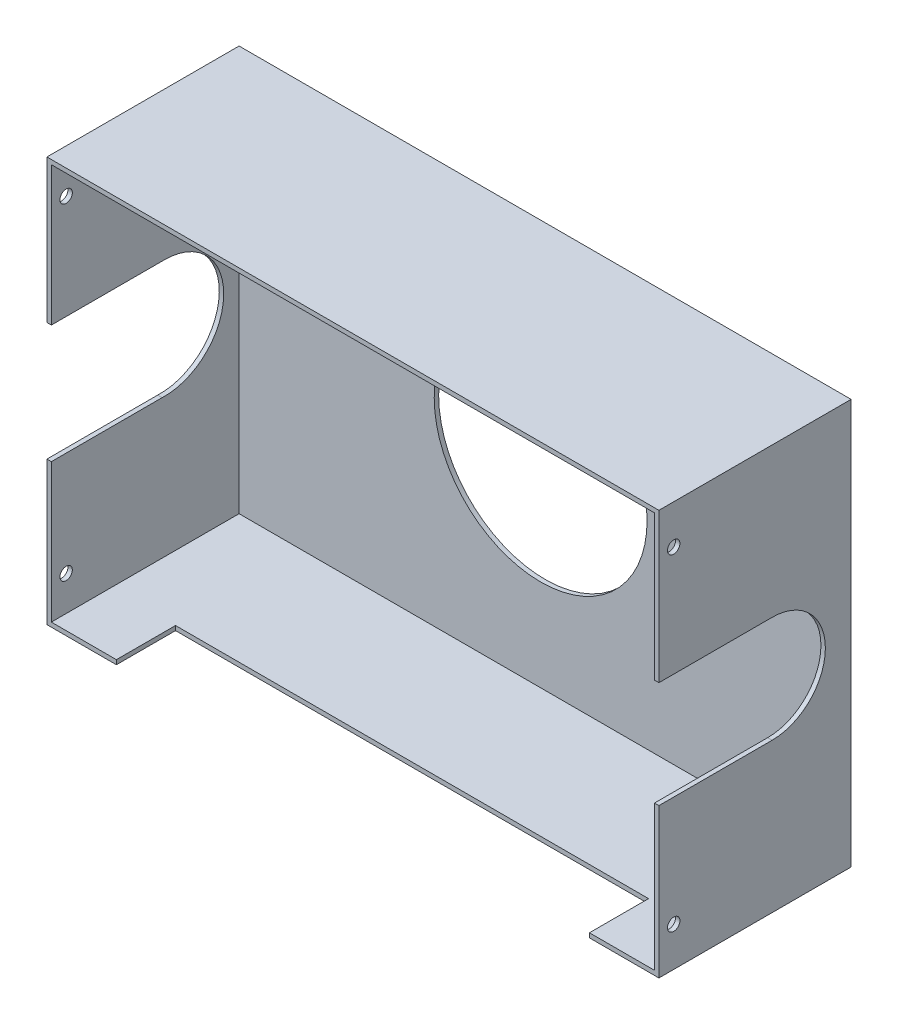
ISO-10303-21;
HEADER;
FILE_DESCRIPTION(('STEP AP214'),'2;1');
FILE_NAME('part.step','',(''),(''),'','','');
FILE_SCHEMA(('AUTOMOTIVE_DESIGN { 1 0 10303 214 1 1 1 1 }'));
ENDSEC;
DATA;
#1=APPLICATION_CONTEXT('core data for automotive mechanical design processes');
#2=APPLICATION_PROTOCOL_DEFINITION('international standard','automotive_design',2000,#1);
#3=PRODUCT_CONTEXT('',#1,'mechanical');
#4=PRODUCT('Part','Part','',(#3));
#5=PRODUCT_RELATED_PRODUCT_CATEGORY('part','',(#4));
#6=PRODUCT_DEFINITION_FORMATION('','',#4);
#7=PRODUCT_DEFINITION_CONTEXT('part definition',#1,'design');
#8=PRODUCT_DEFINITION('design','',#6,#7);
#9=PRODUCT_DEFINITION_SHAPE('','',#8);
#10=(LENGTH_UNIT() NAMED_UNIT(*) SI_UNIT(.MILLI.,.METRE.));
#11=(NAMED_UNIT(*) PLANE_ANGLE_UNIT() SI_UNIT($,.RADIAN.));
#12=(NAMED_UNIT(*) SI_UNIT($,.STERADIAN.) SOLID_ANGLE_UNIT());
#13=UNCERTAINTY_MEASURE_WITH_UNIT(LENGTH_MEASURE(1.E-05),#10,'distance_accuracy_value','');
#14=(GEOMETRIC_REPRESENTATION_CONTEXT(3) GLOBAL_UNCERTAINTY_ASSIGNED_CONTEXT((#13)) GLOBAL_UNIT_ASSIGNED_CONTEXT((#10,
#11,#12)) REPRESENTATION_CONTEXT('',''));
#15=CARTESIAN_POINT('',(0.,0.,0.));
#16=DIRECTION('',(0.,0.,1.));
#17=DIRECTION('',(1.,0.,0.));
#18=AXIS2_PLACEMENT_3D('',#15,#16,#17);
#19=CARTESIAN_POINT('',(0.,0.,65.));
#20=DIRECTION('',(0.,0.,1.));
#21=DIRECTION('',(1.,0.,0.));
#22=AXIS2_PLACEMENT_3D('',#19,#20,#21);
#23=PLANE('',#22);
#24=DIRECTION('',(0.,-1.,0.));
#25=VECTOR('',#24,1.);
#26=CARTESIAN_POINT('',(80.,68.501,65.));
#27=LINE('',#26,#25);
#28=CARTESIAN_POINT('',(80.,-67.,65.));
#29=VERTEX_POINT('',#28);
#30=CARTESIAN_POINT('',(80.,-68.5,65.));
#31=VERTEX_POINT('',#30);
#32=EDGE_CURVE('E335',#29,#31,#27,.T.);
#33=ORIENTED_EDGE('',*,*,#32,.T.);
#34=DIRECTION('',(1.,0.,0.));
#35=VECTOR('',#34,1.);
#36=CARTESIAN_POINT('',(-103.5,-68.5,65.));
#37=LINE('',#36,#35);
#38=CARTESIAN_POINT('',(103.5,-68.5,65.));
#39=VERTEX_POINT('',#38);
#40=EDGE_CURVE('E205',#31,#39,#37,.T.);
#41=ORIENTED_EDGE('',*,*,#40,.T.);
#42=DIRECTION('',(0.,1.,0.));
#43=VECTOR('',#42,1.);
#44=CARTESIAN_POINT('',(103.5,68.5,65.));
#45=LINE('',#44,#43);
#46=CARTESIAN_POINT('',(103.5,-18.,65.));
#47=VERTEX_POINT('',#46);
#48=EDGE_CURVE('E195',#39,#47,#45,.T.);
#49=ORIENTED_EDGE('',*,*,#48,.T.);
#50=DIRECTION('',(1.,0.,0.));
#51=VECTOR('',#50,1.);
#52=CARTESIAN_POINT('',(-103.501,-18.,65.));
#53=LINE('',#52,#51);
#54=CARTESIAN_POINT('',(102.,-18.,65.));
#55=VERTEX_POINT('',#54);
#56=EDGE_CURVE('E249',#55,#47,#53,.T.);
#57=ORIENTED_EDGE('',*,*,#56,.F.);
#58=DIRECTION('',(0.,1.,0.));
#59=VECTOR('',#58,1.);
#60=CARTESIAN_POINT('',(102.,68.5,65.));
#61=LINE('',#60,#59);
#62=CARTESIAN_POINT('',(102.,-67.,65.));
#63=VERTEX_POINT('',#62);
#64=EDGE_CURVE('E284',#63,#55,#61,.T.);
#65=ORIENTED_EDGE('',*,*,#64,.F.);
#66=DIRECTION('',(1.,0.,0.));
#67=VECTOR('',#66,1.);
#68=CARTESIAN_POINT('',(-103.5,-67.,65.));
#69=LINE('',#68,#67);
#70=EDGE_CURVE('E190',#29,#63,#69,.T.);
#71=ORIENTED_EDGE('',*,*,#70,.F.);
#72=EDGE_LOOP('',(#33,#41,#49,#57,#65,#71));
#73=FACE_BOUND('',#72,.T.);
#74=ADVANCED_FACE('F32',(#73),#23,.T.);
#75=CARTESIAN_POINT('',(-103.5,68.5,65.));
#76=DIRECTION('',(1.,0.,0.));
#77=DIRECTION('',(0.,0.,-1.));
#78=AXIS2_PLACEMENT_3D('',#75,#76,#77);
#79=PLANE('',#78);
#80=CARTESIAN_POINT('',(-103.5,55.25,60.));
#81=DIRECTION('',(-1.,0.,0.));
#82=DIRECTION('',(0.,0.,1.));
#83=AXIS2_PLACEMENT_3D('',#80,#81,#82);
#84=CIRCLE('',#83,2.1);
#85=CARTESIAN_POINT('',(-103.5,55.25,62.1));
#86=VERTEX_POINT('',#85);
#87=EDGE_CURVE('E344',#86,#86,#84,.T.);
#88=ORIENTED_EDGE('',*,*,#87,.F.);
#89=EDGE_LOOP('',(#88));
#90=FACE_BOUND('',#89,.T.);
#91=CARTESIAN_POINT('',(-103.5,-55.25,60.));
#92=DIRECTION('',(-1.,0.,0.));
#93=DIRECTION('',(0.,0.,1.));
#94=AXIS2_PLACEMENT_3D('',#91,#92,#93);
#95=CIRCLE('',#94,2.1);
#96=CARTESIAN_POINT('',(-103.5,-55.25,62.1));
#97=VERTEX_POINT('',#96);
#98=EDGE_CURVE('E356',#97,#97,#95,.T.);
#99=ORIENTED_EDGE('',*,*,#98,.F.);
#100=EDGE_LOOP('',(#99));
#101=FACE_BOUND('',#100,.T.);
#102=DIRECTION('',(0.,-0.000472738220498061,0.999999888259281));
#103=VECTOR('',#102,1.);
#104=CARTESIAN_POINT('',(-103.5,-19.9999802218939,64.9581626721609));
#105=LINE('',#104,#103);
#106=CARTESIAN_POINT('',(-103.5,-19.9822919019545,27.5414335060377));
#107=VERTEX_POINT('',#106);
#108=CARTESIAN_POINT('',(-103.5,-20.,65.));
#109=VERTEX_POINT('',#108);
#110=EDGE_CURVE('E235',#107,#109,#105,.T.);
#111=ORIENTED_EDGE('',*,*,#110,.F.);
#112=CARTESIAN_POINT('',(-103.5,0.,26.7));
#113=DIRECTION('',(-1.,0.,0.));
#114=DIRECTION('',(0.,0.,1.));
#115=AXIS2_PLACEMENT_3D('',#112,#113,#114);
#116=CIRCLE('',#115,20.);
#117=CARTESIAN_POINT('',(-103.5,20.,26.7));
#118=VERTEX_POINT('',#117);
#119=EDGE_CURVE('E230',#118,#107,#116,.T.);
#120=ORIENTED_EDGE('',*,*,#119,.F.);
#121=DIRECTION('',(0.,0.,-1.));
#122=VECTOR('',#121,1.);
#123=CARTESIAN_POINT('',(-103.5,20.,65.));
#124=LINE('',#123,#122);
#125=CARTESIAN_POINT('',(-103.5,20.,65.));
#126=VERTEX_POINT('',#125);
#127=EDGE_CURVE('E231',#126,#118,#124,.T.);
#128=ORIENTED_EDGE('',*,*,#127,.F.);
#129=DIRECTION('',(0.,-1.,0.));
#130=VECTOR('',#129,1.);
#131=CARTESIAN_POINT('',(-103.5,68.5,65.));
#132=LINE('',#131,#130);
#133=CARTESIAN_POINT('',(-103.5,68.5,65.));
#134=VERTEX_POINT('',#133);
#135=EDGE_CURVE('E202',#134,#126,#132,.T.);
#136=ORIENTED_EDGE('',*,*,#135,.F.);
#137=DIRECTION('',(0.,0.,-1.));
#138=VECTOR('',#137,1.);
#139=CARTESIAN_POINT('',(-103.5,68.5,65.));
#140=LINE('',#139,#138);
#141=CARTESIAN_POINT('',(-103.5,68.5,0.));
#142=VERTEX_POINT('',#141);
#143=EDGE_CURVE('E41',#134,#142,#140,.T.);
#144=ORIENTED_EDGE('',*,*,#143,.T.);
#145=DIRECTION('',(0.,-1.,0.));
#146=VECTOR('',#145,1.);
#147=CARTESIAN_POINT('',(-103.5,68.5,0.));
#148=LINE('',#147,#146);
#149=CARTESIAN_POINT('',(-103.5,-68.5,0.));
#150=VERTEX_POINT('',#149);
#151=EDGE_CURVE('E215',#142,#150,#148,.T.);
#152=ORIENTED_EDGE('',*,*,#151,.T.);
#153=DIRECTION('',(0.,0.,-1.));
#154=VECTOR('',#153,1.);
#155=CARTESIAN_POINT('',(-103.5,-68.5,65.));
#156=LINE('',#155,#154);
#157=CARTESIAN_POINT('',(-103.5,-68.5,65.));
#158=VERTEX_POINT('',#157);
#159=EDGE_CURVE('E221',#158,#150,#156,.T.);
#160=ORIENTED_EDGE('',*,*,#159,.F.);
#161=EDGE_CURVE('E201',#109,#158,#132,.T.);
#162=ORIENTED_EDGE('',*,*,#161,.F.);
#163=EDGE_LOOP('',(#111,#120,#128,#136,#144,#152,#160,#162));
#164=FACE_BOUND('',#163,.T.);
#165=ADVANCED_FACE('F303',(#90,#101,#164),#79,.F.);
#166=DIRECTION('',(0.,-1.,0.));
#167=VECTOR('',#166,1.);
#168=CARTESIAN_POINT('',(-80.,68.501,65.));
#169=LINE('',#168,#167);
#170=CARTESIAN_POINT('',(-80.,-67.,65.));
#171=VERTEX_POINT('',#170);
#172=CARTESIAN_POINT('',(-80.,-68.5,65.));
#173=VERTEX_POINT('',#172);
#174=EDGE_CURVE('E189',#171,#173,#169,.T.);
#175=ORIENTED_EDGE('',*,*,#174,.F.);
#176=CARTESIAN_POINT('',(-102.,-67.,65.));
#177=VERTEX_POINT('',#176);
#178=EDGE_CURVE('E179',#177,#171,#69,.T.);
#179=ORIENTED_EDGE('',*,*,#178,.F.);
#180=DIRECTION('',(0.,-1.,0.));
#181=VECTOR('',#180,1.);
#182=CARTESIAN_POINT('',(-102.,68.5,65.));
#183=LINE('',#182,#181);
#184=CARTESIAN_POINT('',(-102.,-20.,65.));
#185=VERTEX_POINT('',#184);
#186=EDGE_CURVE('E160',#185,#177,#183,.T.);
#187=ORIENTED_EDGE('',*,*,#186,.F.);
#188=DIRECTION('',(1.,0.,0.));
#189=VECTOR('',#188,1.);
#190=CARTESIAN_POINT('',(-103.500012,-20.,65.));
#191=LINE('',#190,#189);
#192=EDGE_CURVE('E232',#109,#185,#191,.T.);
#193=ORIENTED_EDGE('',*,*,#192,.F.);
#194=ORIENTED_EDGE('',*,*,#161,.T.);
#195=EDGE_CURVE('E206',#158,#173,#37,.T.);
#196=ORIENTED_EDGE('',*,*,#195,.T.);
#197=EDGE_LOOP('',(#175,#179,#187,#193,#194,#196));
#198=FACE_BOUND('',#197,.T.);
#199=ADVANCED_FACE('F186',(#198),#23,.T.);
#200=ORIENTED_EDGE('',*,*,#135,.T.);
#201=DIRECTION('',(1.,0.,0.));
#202=VECTOR('',#201,1.);
#203=CARTESIAN_POINT('',(-103.500012,20.,65.));
#204=LINE('',#203,#202);
#205=CARTESIAN_POINT('',(-102.,20.,65.));
#206=VERTEX_POINT('',#205);
#207=EDGE_CURVE('E237',#126,#206,#204,.T.);
#208=ORIENTED_EDGE('',*,*,#207,.T.);
#209=CARTESIAN_POINT('',(-102.,67.,65.));
#210=VERTEX_POINT('',#209);
#211=EDGE_CURVE('E170',#210,#206,#183,.T.);
#212=ORIENTED_EDGE('',*,*,#211,.F.);
#213=DIRECTION('',(-1.,0.,0.));
#214=VECTOR('',#213,1.);
#215=CARTESIAN_POINT('',(-103.5,67.,65.));
#216=LINE('',#215,#214);
#217=CARTESIAN_POINT('',(102.,67.,65.));
#218=VERTEX_POINT('',#217);
#219=EDGE_CURVE('E171',#218,#210,#216,.T.);
#220=ORIENTED_EDGE('',*,*,#219,.F.);
#221=CARTESIAN_POINT('',(102.,18.,65.));
#222=VERTEX_POINT('',#221);
#223=EDGE_CURVE('E283',#222,#218,#61,.T.);
#224=ORIENTED_EDGE('',*,*,#223,.F.);
#225=DIRECTION('',(1.,0.,0.));
#226=VECTOR('',#225,1.);
#227=CARTESIAN_POINT('',(-103.501,18.,65.));
#228=LINE('',#227,#226);
#229=CARTESIAN_POINT('',(103.5,18.,65.));
#230=VERTEX_POINT('',#229);
#231=EDGE_CURVE('E248',#222,#230,#228,.T.);
#232=ORIENTED_EDGE('',*,*,#231,.T.);
#233=CARTESIAN_POINT('',(103.5,68.5,65.));
#234=VERTEX_POINT('',#233);
#235=EDGE_CURVE('E199',#230,#234,#45,.T.);
#236=ORIENTED_EDGE('',*,*,#235,.T.);
#237=DIRECTION('',(-1.,0.,0.));
#238=VECTOR('',#237,1.);
#239=CARTESIAN_POINT('',(-103.5,68.5,65.));
#240=LINE('',#239,#238);
#241=EDGE_CURVE('E198',#234,#134,#240,.T.);
#242=ORIENTED_EDGE('',*,*,#241,.T.);
#243=EDGE_LOOP('',(#200,#208,#212,#220,#224,#232,#236,#242));
#244=FACE_BOUND('',#243,.T.);
#245=ADVANCED_FACE('F296',(#244),#23,.T.);
#246=CARTESIAN_POINT('',(-102.,68.5,65.));
#247=DIRECTION('',(1.,0.,0.));
#248=DIRECTION('',(0.,0.,-1.));
#249=AXIS2_PLACEMENT_3D('',#246,#247,#248);
#250=PLANE('',#249);
#251=CARTESIAN_POINT('',(-102.,55.25,60.));
#252=DIRECTION('',(1.,0.,0.));
#253=DIRECTION('',(0.,0.,-1.));
#254=AXIS2_PLACEMENT_3D('',#251,#252,#253);
#255=CIRCLE('',#254,2.09999999999999);
#256=CARTESIAN_POINT('',(-102.,55.25,57.9));
#257=VERTEX_POINT('',#256);
#258=EDGE_CURVE('E353',#257,#257,#255,.T.);
#259=ORIENTED_EDGE('',*,*,#258,.F.);
#260=EDGE_LOOP('',(#259));
#261=FACE_BOUND('',#260,.T.);
#262=CARTESIAN_POINT('',(-102.,-55.25,60.));
#263=DIRECTION('',(1.,0.,0.));
#264=DIRECTION('',(0.,0.,-1.));
#265=AXIS2_PLACEMENT_3D('',#262,#263,#264);
#266=CIRCLE('',#265,2.09999999999999);
#267=CARTESIAN_POINT('',(-102.,-55.25,57.9));
#268=VERTEX_POINT('',#267);
#269=EDGE_CURVE('E362',#268,#268,#266,.T.);
#270=ORIENTED_EDGE('',*,*,#269,.F.);
#271=EDGE_LOOP('',(#270));
#272=FACE_BOUND('',#271,.T.);
#273=CARTESIAN_POINT('',(-102.,0.,26.7));
#274=DIRECTION('',(1.,0.,0.));
#275=DIRECTION('',(0.,0.,-1.));
#276=AXIS2_PLACEMENT_3D('',#273,#274,#275);
#277=CIRCLE('',#276,20.);
#278=CARTESIAN_POINT('',(-102.,20.,26.7));
#279=VERTEX_POINT('',#278);
#280=CARTESIAN_POINT('',(-102.,-19.9822919019545,27.5414335060376));
#281=VERTEX_POINT('',#280);
#282=EDGE_CURVE('E76',#279,#281,#277,.F.);
#283=ORIENTED_EDGE('',*,*,#282,.T.);
#284=DIRECTION('',(0.,-0.000472738220498061,0.999999888259281));
#285=VECTOR('',#284,1.);
#286=CARTESIAN_POINT('',(-102.,-20.,65.));
#287=LINE('',#286,#285);
#288=EDGE_CURVE('E166',#281,#185,#287,.T.);
#289=ORIENTED_EDGE('',*,*,#288,.T.);
#290=ORIENTED_EDGE('',*,*,#186,.T.);
#291=DIRECTION('',(0.,0.,-1.));
#292=VECTOR('',#291,1.);
#293=CARTESIAN_POINT('',(-102.,-67.,65.));
#294=LINE('',#293,#292);
#295=CARTESIAN_POINT('',(-102.,-67.,1.5));
#296=VERTEX_POINT('',#295);
#297=EDGE_CURVE('E164',#177,#296,#294,.T.);
#298=ORIENTED_EDGE('',*,*,#297,.T.);
#299=DIRECTION('',(0.,-1.,0.));
#300=VECTOR('',#299,1.);
#301=CARTESIAN_POINT('',(-102.,68.5,1.5));
#302=LINE('',#301,#300);
#303=CARTESIAN_POINT('',(-102.,67.,1.5));
#304=VERTEX_POINT('',#303);
#305=EDGE_CURVE('E278',#304,#296,#302,.T.);
#306=ORIENTED_EDGE('',*,*,#305,.F.);
#307=DIRECTION('',(0.,0.,-1.));
#308=VECTOR('',#307,1.);
#309=CARTESIAN_POINT('',(-102.,67.,65.));
#310=LINE('',#309,#308);
#311=EDGE_CURVE('E182',#210,#304,#310,.T.);
#312=ORIENTED_EDGE('',*,*,#311,.F.);
#313=ORIENTED_EDGE('',*,*,#211,.T.);
#314=DIRECTION('',(0.,0.,-1.));
#315=VECTOR('',#314,1.);
#316=CARTESIAN_POINT('',(-102.,20.,26.7));
#317=LINE('',#316,#315);
#318=EDGE_CURVE('E301',#206,#279,#317,.T.);
#319=ORIENTED_EDGE('',*,*,#318,.T.);
#320=EDGE_LOOP('',(#283,#289,#290,#298,#306,#312,#313,#319));
#321=FACE_BOUND('',#320,.T.);
#322=ADVANCED_FACE('F162',(#261,#272,#321),#250,.T.);
#323=CARTESIAN_POINT('',(103.5,68.5,65.));
#324=DIRECTION('',(-1.,0.,0.));
#325=DIRECTION('',(0.,-1.,0.));
#326=AXIS2_PLACEMENT_3D('',#323,#324,#325);
#327=PLANE('',#326);
#328=CARTESIAN_POINT('',(103.5,55.25,60.));
#329=DIRECTION('',(-1.,0.,0.));
#330=DIRECTION('',(0.,0.,1.));
#331=AXIS2_PLACEMENT_3D('',#328,#329,#330);
#332=CIRCLE('',#331,2.09999999999998);
#333=CARTESIAN_POINT('',(103.5,55.25,62.1));
#334=VERTEX_POINT('',#333);
#335=EDGE_CURVE('E347',#334,#334,#332,.T.);
#336=ORIENTED_EDGE('',*,*,#335,.T.);
#337=EDGE_LOOP('',(#336));
#338=FACE_BOUND('',#337,.T.);
#339=CARTESIAN_POINT('',(103.5,-55.25,60.));
#340=DIRECTION('',(-1.,0.,0.));
#341=DIRECTION('',(0.,0.,1.));
#342=AXIS2_PLACEMENT_3D('',#339,#340,#341);
#343=CIRCLE('',#342,2.09999999999998);
#344=CARTESIAN_POINT('',(103.5,-55.25,62.1));
#345=VERTEX_POINT('',#344);
#346=EDGE_CURVE('E359',#345,#345,#343,.T.);
#347=ORIENTED_EDGE('',*,*,#346,.T.);
#348=EDGE_LOOP('',(#347));
#349=FACE_BOUND('',#348,.T.);
#350=CARTESIAN_POINT('',(103.5,0.,26.7));
#351=DIRECTION('',(1.,0.,0.));
#352=DIRECTION('',(0.,1.,0.));
#353=AXIS2_PLACEMENT_3D('',#350,#351,#352);
#354=CIRCLE('',#353,18.);
#355=CARTESIAN_POINT('',(103.5,-18.,26.7));
#356=VERTEX_POINT('',#355);
#357=CARTESIAN_POINT('',(103.5,18.,26.7));
#358=VERTEX_POINT('',#357);
#359=EDGE_CURVE('E255',#356,#358,#354,.T.);
#360=ORIENTED_EDGE('',*,*,#359,.F.);
#361=DIRECTION('',(0.,0.,-1.));
#362=VECTOR('',#361,1.);
#363=CARTESIAN_POINT('',(103.5,-18.,65.));
#364=LINE('',#363,#362);
#365=EDGE_CURVE('E250',#47,#356,#364,.T.);
#366=ORIENTED_EDGE('',*,*,#365,.F.);
#367=ORIENTED_EDGE('',*,*,#48,.F.);
#368=DIRECTION('',(0.,0.,-1.));
#369=VECTOR('',#368,1.);
#370=CARTESIAN_POINT('',(103.5,-68.5,65.));
#371=LINE('',#370,#369);
#372=CARTESIAN_POINT('',(103.5,-68.5,0.));
#373=VERTEX_POINT('',#372);
#374=EDGE_CURVE('E208',#39,#373,#371,.T.);
#375=ORIENTED_EDGE('',*,*,#374,.T.);
#376=DIRECTION('',(0.,1.,0.));
#377=VECTOR('',#376,1.);
#378=CARTESIAN_POINT('',(103.5,68.5,0.));
#379=LINE('',#378,#377);
#380=CARTESIAN_POINT('',(103.5,68.5,0.));
#381=VERTEX_POINT('',#380);
#382=EDGE_CURVE('E209',#373,#381,#379,.T.);
#383=ORIENTED_EDGE('',*,*,#382,.T.);
#384=DIRECTION('',(0.,0.,-1.));
#385=VECTOR('',#384,1.);
#386=CARTESIAN_POINT('',(103.5,68.5,65.));
#387=LINE('',#386,#385);
#388=EDGE_CURVE('E11',#234,#381,#387,.T.);
#389=ORIENTED_EDGE('',*,*,#388,.F.);
#390=ORIENTED_EDGE('',*,*,#235,.F.);
#391=DIRECTION('',(0.,0.,1.));
#392=VECTOR('',#391,1.);
#393=CARTESIAN_POINT('',(103.5,18.,26.7));
#394=LINE('',#393,#392);
#395=EDGE_CURVE('E253',#358,#230,#394,.T.);
#396=ORIENTED_EDGE('',*,*,#395,.F.);
#397=EDGE_LOOP('',(#360,#366,#367,#375,#383,#389,#390,#396));
#398=FACE_BOUND('',#397,.T.);
#399=ADVANCED_FACE('F34',(#338,#349,#398),#327,.F.);
#400=CARTESIAN_POINT('',(-103.5,68.5,65.));
#401=DIRECTION('',(0.,-1.,0.));
#402=DIRECTION('',(0.,0.,-1.));
#403=AXIS2_PLACEMENT_3D('',#400,#401,#402);
#404=PLANE('',#403);
#405=DIRECTION('',(-1.,0.,0.));
#406=VECTOR('',#405,1.);
#407=CARTESIAN_POINT('',(-103.5,68.5,0.));
#408=LINE('',#407,#406);
#409=EDGE_CURVE('E212',#381,#142,#408,.T.);
#410=ORIENTED_EDGE('',*,*,#409,.T.);
#411=ORIENTED_EDGE('',*,*,#143,.F.);
#412=ORIENTED_EDGE('',*,*,#241,.F.);
#413=ORIENTED_EDGE('',*,*,#388,.T.);
#414=EDGE_LOOP('',(#410,#411,#412,#413));
#415=FACE_BOUND('',#414,.T.);
#416=ADVANCED_FACE('F417',(#415),#404,.F.);
#417=CARTESIAN_POINT('',(-103.5,-68.5,65.));
#418=DIRECTION('',(0.,1.,0.));
#419=DIRECTION('',(0.,0.,1.));
#420=AXIS2_PLACEMENT_3D('',#417,#418,#419);
#421=PLANE('',#420);
#422=ORIENTED_EDGE('',*,*,#40,.F.);
#423=DIRECTION('',(0.,0.,1.));
#424=VECTOR('',#423,1.);
#425=CARTESIAN_POINT('',(80.,-68.5,65.));
#426=LINE('',#425,#424);
#427=CARTESIAN_POINT('',(80.,-68.5,45.));
#428=VERTEX_POINT('',#427);
#429=EDGE_CURVE('E325',#428,#31,#426,.T.);
#430=ORIENTED_EDGE('',*,*,#429,.F.);
#431=DIRECTION('',(1.,0.,0.));
#432=VECTOR('',#431,1.);
#433=CARTESIAN_POINT('',(-80.,-68.5,45.));
#434=LINE('',#433,#432);
#435=CARTESIAN_POINT('',(-80.,-68.5,45.));
#436=VERTEX_POINT('',#435);
#437=EDGE_CURVE('E320',#436,#428,#434,.T.);
#438=ORIENTED_EDGE('',*,*,#437,.F.);
#439=DIRECTION('',(0.,0.,-1.));
#440=VECTOR('',#439,1.);
#441=CARTESIAN_POINT('',(-80.,-68.5,65.));
#442=LINE('',#441,#440);
#443=EDGE_CURVE('E316',#173,#436,#442,.T.);
#444=ORIENTED_EDGE('',*,*,#443,.F.);
#445=ORIENTED_EDGE('',*,*,#195,.F.);
#446=ORIENTED_EDGE('',*,*,#159,.T.);
#447=DIRECTION('',(1.,0.,0.));
#448=VECTOR('',#447,1.);
#449=CARTESIAN_POINT('',(-103.5,-68.5,0.));
#450=LINE('',#449,#448);
#451=EDGE_CURVE('E217',#150,#373,#450,.T.);
#452=ORIENTED_EDGE('',*,*,#451,.T.);
#453=ORIENTED_EDGE('',*,*,#374,.F.);
#454=EDGE_LOOP('',(#422,#430,#438,#444,#445,#446,#452,#453));
#455=FACE_BOUND('',#454,.T.);
#456=ADVANCED_FACE('F314',(#455),#421,.F.);
#457=CARTESIAN_POINT('',(0.,0.,0.));
#458=DIRECTION('',(0.,0.,1.));
#459=DIRECTION('',(1.,0.,0.));
#460=AXIS2_PLACEMENT_3D('',#457,#458,#459);
#461=PLANE('',#460);
#462=CARTESIAN_POINT('',(0.,0.,0.));
#463=DIRECTION('',(0.,0.,-1.));
#464=DIRECTION('',(-1.,0.,0.));
#465=AXIS2_PLACEMENT_3D('',#462,#463,#464);
#466=CIRCLE('',#465,36.);
#467=CARTESIAN_POINT('',(-36.,0.,0.));
#468=VERTEX_POINT('',#467);
#469=EDGE_CURVE('E229',#468,#468,#466,.T.);
#470=ORIENTED_EDGE('',*,*,#469,.F.);
#471=EDGE_LOOP('',(#470));
#472=FACE_BOUND('',#471,.T.);
#473=ORIENTED_EDGE('',*,*,#382,.F.);
#474=ORIENTED_EDGE('',*,*,#451,.F.);
#475=ORIENTED_EDGE('',*,*,#151,.F.);
#476=ORIENTED_EDGE('',*,*,#409,.F.);
#477=EDGE_LOOP('',(#473,#474,#475,#476));
#478=FACE_BOUND('',#477,.T.);
#479=ADVANCED_FACE('F431',(#472,#478),#461,.F.);
#480=CARTESIAN_POINT('',(102.,68.5,65.));
#481=DIRECTION('',(-1.,0.,0.));
#482=DIRECTION('',(0.,-1.,0.));
#483=AXIS2_PLACEMENT_3D('',#480,#481,#482);
#484=PLANE('',#483);
#485=CARTESIAN_POINT('',(102.,55.25,60.));
#486=DIRECTION('',(-1.,0.,0.));
#487=DIRECTION('',(0.,-1.,0.));
#488=AXIS2_PLACEMENT_3D('',#485,#486,#487);
#489=CIRCLE('',#488,2.09999999999999);
#490=CARTESIAN_POINT('',(102.,53.15,60.));
#491=VERTEX_POINT('',#490);
#492=EDGE_CURVE('E350',#491,#491,#489,.T.);
#493=ORIENTED_EDGE('',*,*,#492,.F.);
#494=EDGE_LOOP('',(#493));
#495=FACE_BOUND('',#494,.T.);
#496=CARTESIAN_POINT('',(102.,-55.25,60.));
#497=DIRECTION('',(-1.,0.,0.));
#498=DIRECTION('',(0.,-1.,0.));
#499=AXIS2_PLACEMENT_3D('',#496,#497,#498);
#500=CIRCLE('',#499,2.09999999999999);
#501=CARTESIAN_POINT('',(102.,-57.35,60.));
#502=VERTEX_POINT('',#501);
#503=EDGE_CURVE('E36',#502,#502,#500,.T.);
#504=ORIENTED_EDGE('',*,*,#503,.F.);
#505=EDGE_LOOP('',(#504));
#506=FACE_BOUND('',#505,.T.);
#507=DIRECTION('',(0.,0.,-1.));
#508=VECTOR('',#507,1.);
#509=CARTESIAN_POINT('',(102.,-18.,65.));
#510=LINE('',#509,#508);
#511=CARTESIAN_POINT('',(102.,-18.,26.7));
#512=VERTEX_POINT('',#511);
#513=EDGE_CURVE('E258',#55,#512,#510,.T.);
#514=ORIENTED_EDGE('',*,*,#513,.T.);
#515=CARTESIAN_POINT('',(102.,0.,26.7));
#516=DIRECTION('',(-1.,0.,0.));
#517=DIRECTION('',(0.,-1.,0.));
#518=AXIS2_PLACEMENT_3D('',#515,#516,#517);
#519=CIRCLE('',#518,18.);
#520=CARTESIAN_POINT('',(102.,18.,26.7));
#521=VERTEX_POINT('',#520);
#522=EDGE_CURVE('E244',#512,#521,#519,.F.);
#523=ORIENTED_EDGE('',*,*,#522,.T.);
#524=DIRECTION('',(0.,0.,1.));
#525=VECTOR('',#524,1.);
#526=CARTESIAN_POINT('',(102.,18.,26.7));
#527=LINE('',#526,#525);
#528=EDGE_CURVE('E245',#521,#222,#527,.T.);
#529=ORIENTED_EDGE('',*,*,#528,.T.);
#530=ORIENTED_EDGE('',*,*,#223,.T.);
#531=DIRECTION('',(0.,0.,-1.));
#532=VECTOR('',#531,1.);
#533=CARTESIAN_POINT('',(102.,67.,65.));
#534=LINE('',#533,#532);
#535=CARTESIAN_POINT('',(102.,67.,1.5));
#536=VERTEX_POINT('',#535);
#537=EDGE_CURVE('E213',#218,#536,#534,.T.);
#538=ORIENTED_EDGE('',*,*,#537,.T.);
#539=DIRECTION('',(0.,1.,0.));
#540=VECTOR('',#539,1.);
#541=CARTESIAN_POINT('',(102.,68.5,1.5));
#542=LINE('',#541,#540);
#543=CARTESIAN_POINT('',(102.,-67.,1.5));
#544=VERTEX_POINT('',#543);
#545=EDGE_CURVE('E228',#544,#536,#542,.T.);
#546=ORIENTED_EDGE('',*,*,#545,.F.);
#547=DIRECTION('',(0.,0.,-1.));
#548=VECTOR('',#547,1.);
#549=CARTESIAN_POINT('',(102.,-67.,65.));
#550=LINE('',#549,#548);
#551=EDGE_CURVE('E183',#63,#544,#550,.T.);
#552=ORIENTED_EDGE('',*,*,#551,.F.);
#553=ORIENTED_EDGE('',*,*,#64,.T.);
#554=EDGE_LOOP('',(#514,#523,#529,#530,#538,#546,#552,#553));
#555=FACE_BOUND('',#554,.T.);
#556=ADVANCED_FACE('F439',(#495,#506,#555),#484,.T.);
#557=CARTESIAN_POINT('',(-103.5,67.,65.));
#558=DIRECTION('',(0.,-1.,0.));
#559=DIRECTION('',(0.,0.,-1.));
#560=AXIS2_PLACEMENT_3D('',#557,#558,#559);
#561=PLANE('',#560);
#562=DIRECTION('',(-1.,0.,0.));
#563=VECTOR('',#562,1.);
#564=CARTESIAN_POINT('',(-103.5,67.,1.5));
#565=LINE('',#564,#563);
#566=EDGE_CURVE('E274',#536,#304,#565,.T.);
#567=ORIENTED_EDGE('',*,*,#566,.F.);
#568=ORIENTED_EDGE('',*,*,#537,.F.);
#569=ORIENTED_EDGE('',*,*,#219,.T.);
#570=ORIENTED_EDGE('',*,*,#311,.T.);
#571=EDGE_LOOP('',(#567,#568,#569,#570));
#572=FACE_BOUND('',#571,.T.);
#573=ADVANCED_FACE('F290',(#572),#561,.T.);
#574=CARTESIAN_POINT('',(-103.5,-67.,65.));
#575=DIRECTION('',(0.,1.,0.));
#576=DIRECTION('',(0.,0.,1.));
#577=AXIS2_PLACEMENT_3D('',#574,#575,#576);
#578=PLANE('',#577);
#579=DIRECTION('',(0.,0.,1.));
#580=VECTOR('',#579,1.);
#581=CARTESIAN_POINT('',(80.,-67.,65.));
#582=LINE('',#581,#580);
#583=CARTESIAN_POINT('',(80.,-67.,45.));
#584=VERTEX_POINT('',#583);
#585=EDGE_CURVE('E327',#584,#29,#582,.T.);
#586=ORIENTED_EDGE('',*,*,#585,.T.);
#587=ORIENTED_EDGE('',*,*,#70,.T.);
#588=ORIENTED_EDGE('',*,*,#551,.T.);
#589=DIRECTION('',(1.,0.,0.));
#590=VECTOR('',#589,1.);
#591=CARTESIAN_POINT('',(-103.5,-67.,1.5));
#592=LINE('',#591,#590);
#593=EDGE_CURVE('E181',#296,#544,#592,.T.);
#594=ORIENTED_EDGE('',*,*,#593,.F.);
#595=ORIENTED_EDGE('',*,*,#297,.F.);
#596=ORIENTED_EDGE('',*,*,#178,.T.);
#597=DIRECTION('',(0.,0.,-1.));
#598=VECTOR('',#597,1.);
#599=CARTESIAN_POINT('',(-80.,-67.,65.));
#600=LINE('',#599,#598);
#601=CARTESIAN_POINT('',(-80.,-67.,45.));
#602=VERTEX_POINT('',#601);
#603=EDGE_CURVE('E323',#171,#602,#600,.T.);
#604=ORIENTED_EDGE('',*,*,#603,.T.);
#605=DIRECTION('',(1.,0.,0.));
#606=VECTOR('',#605,1.);
#607=CARTESIAN_POINT('',(-80.,-67.,45.));
#608=LINE('',#607,#606);
#609=EDGE_CURVE('E334',#602,#584,#608,.T.);
#610=ORIENTED_EDGE('',*,*,#609,.T.);
#611=EDGE_LOOP('',(#586,#587,#588,#594,#595,#596,#604,#610));
#612=FACE_BOUND('',#611,.T.);
#613=ADVANCED_FACE('F176',(#612),#578,.T.);
#614=CARTESIAN_POINT('',(0.,0.,1.5));
#615=DIRECTION('',(0.,0.,1.));
#616=DIRECTION('',(1.,0.,0.));
#617=AXIS2_PLACEMENT_3D('',#614,#615,#616);
#618=PLANE('',#617);
#619=CARTESIAN_POINT('',(0.,0.,1.5));
#620=DIRECTION('',(0.,0.,1.));
#621=DIRECTION('',(1.,0.,0.));
#622=AXIS2_PLACEMENT_3D('',#619,#620,#621);
#623=CIRCLE('',#622,36.);
#624=CARTESIAN_POINT('',(36.,0.,1.5));
#625=VERTEX_POINT('',#624);
#626=EDGE_CURVE('E226',#625,#625,#623,.T.);
#627=ORIENTED_EDGE('',*,*,#626,.F.);
#628=EDGE_LOOP('',(#627));
#629=FACE_BOUND('',#628,.T.);
#630=ORIENTED_EDGE('',*,*,#545,.T.);
#631=ORIENTED_EDGE('',*,*,#566,.T.);
#632=ORIENTED_EDGE('',*,*,#305,.T.);
#633=ORIENTED_EDGE('',*,*,#593,.T.);
#634=EDGE_LOOP('',(#630,#631,#632,#633));
#635=FACE_BOUND('',#634,.T.);
#636=ADVANCED_FACE('F458',(#629,#635),#618,.T.);
#637=CARTESIAN_POINT('',(0.,0.,80.));
#638=DIRECTION('',(0.,0.,-1.));
#639=DIRECTION('',(-1.,0.,0.));
#640=AXIS2_PLACEMENT_3D('',#637,#638,#639);
#641=CYLINDRICAL_SURFACE('',#640,36.);
#642=ORIENTED_EDGE('',*,*,#626,.T.);
#643=EDGE_LOOP('',(#642));
#644=FACE_BOUND('',#643,.T.);
#645=ORIENTED_EDGE('',*,*,#469,.T.);
#646=EDGE_LOOP('',(#645));
#647=FACE_BOUND('',#646,.T.);
#648=ADVANCED_FACE('F465',(#644,#647),#641,.F.);
#649=CARTESIAN_POINT('',(-103.501,0.,26.7));
#650=DIRECTION('',(1.,0.,0.));
#651=DIRECTION('',(0.,1.,0.));
#652=AXIS2_PLACEMENT_3D('',#649,#650,#651);
#653=CYLINDRICAL_SURFACE('',#652,18.);
#654=DIRECTION('',(1.,0.,0.));
#655=VECTOR('',#654,1.);
#656=CARTESIAN_POINT('',(-103.501,-18.,26.7));
#657=LINE('',#656,#655);
#658=EDGE_CURVE('E261',#512,#356,#657,.T.);
#659=ORIENTED_EDGE('',*,*,#658,.T.);
#660=ORIENTED_EDGE('',*,*,#359,.T.);
#661=DIRECTION('',(1.,0.,0.));
#662=VECTOR('',#661,1.);
#663=CARTESIAN_POINT('',(-103.501,18.,26.7));
#664=LINE('',#663,#662);
#665=EDGE_CURVE('E262',#521,#358,#664,.T.);
#666=ORIENTED_EDGE('',*,*,#665,.F.);
#667=ORIENTED_EDGE('',*,*,#522,.F.);
#668=EDGE_LOOP('',(#659,#660,#666,#667));
#669=FACE_BOUND('',#668,.T.);
#670=ADVANCED_FACE('F472',(#669),#653,.F.);
#671=CARTESIAN_POINT('',(-103.501,-18.,65.));
#672=DIRECTION('',(0.,-1.,0.));
#673=DIRECTION('',(1.,0.,0.));
#674=AXIS2_PLACEMENT_3D('',#671,#672,#673);
#675=PLANE('',#674);
#676=ORIENTED_EDGE('',*,*,#56,.T.);
#677=ORIENTED_EDGE('',*,*,#365,.T.);
#678=ORIENTED_EDGE('',*,*,#658,.F.);
#679=ORIENTED_EDGE('',*,*,#513,.F.);
#680=EDGE_LOOP('',(#676,#677,#678,#679));
#681=FACE_BOUND('',#680,.T.);
#682=ADVANCED_FACE('F480',(#681),#675,.F.);
#683=CARTESIAN_POINT('',(-103.501,18.,26.7));
#684=DIRECTION('',(0.,1.,0.));
#685=DIRECTION('',(-1.,0.,0.));
#686=AXIS2_PLACEMENT_3D('',#683,#684,#685);
#687=PLANE('',#686);
#688=ORIENTED_EDGE('',*,*,#665,.T.);
#689=ORIENTED_EDGE('',*,*,#395,.T.);
#690=ORIENTED_EDGE('',*,*,#231,.F.);
#691=ORIENTED_EDGE('',*,*,#528,.F.);
#692=EDGE_LOOP('',(#688,#689,#690,#691));
#693=FACE_BOUND('',#692,.T.);
#694=ADVANCED_FACE('F488',(#693),#687,.F.);
#695=CARTESIAN_POINT('',(-103.500012,-20.,65.));
#696=DIRECTION('',(0.,0.999999888259281,0.000472738220498061));
#697=DIRECTION('',(0.,-0.000472738220498061,0.999999888259281));
#698=AXIS2_PLACEMENT_3D('',#695,#696,#697);
#699=PLANE('',#698);
#700=ORIENTED_EDGE('',*,*,#110,.T.);
#701=ORIENTED_EDGE('',*,*,#192,.T.);
#702=ORIENTED_EDGE('',*,*,#288,.F.);
#703=DIRECTION('',(-1.,0.,0.));
#704=VECTOR('',#703,1.);
#705=CARTESIAN_POINT('',(103.501,-19.9822919019545,27.5414335060376));
#706=LINE('',#705,#704);
#707=EDGE_CURVE('E58',#281,#107,#706,.T.);
#708=ORIENTED_EDGE('',*,*,#707,.T.);
#709=EDGE_LOOP('',(#700,#701,#702,#708));
#710=FACE_BOUND('',#709,.T.);
#711=ADVANCED_FACE('F306',(#710),#699,.T.);
#712=CARTESIAN_POINT('',(-103.500012,20.,26.7));
#713=DIRECTION('',(0.,-1.,0.));
#714=DIRECTION('',(0.,0.,-1.));
#715=AXIS2_PLACEMENT_3D('',#712,#713,#714);
#716=PLANE('',#715);
#717=ORIENTED_EDGE('',*,*,#127,.T.);
#718=DIRECTION('',(-1.,0.,0.));
#719=VECTOR('',#718,1.);
#720=CARTESIAN_POINT('',(103.501,20.,26.7));
#721=LINE('',#720,#719);
#722=EDGE_CURVE('E368',#279,#118,#721,.T.);
#723=ORIENTED_EDGE('',*,*,#722,.F.);
#724=ORIENTED_EDGE('',*,*,#318,.F.);
#725=ORIENTED_EDGE('',*,*,#207,.F.);
#726=EDGE_LOOP('',(#717,#723,#724,#725));
#727=FACE_BOUND('',#726,.T.);
#728=ADVANCED_FACE('F300',(#727),#716,.T.);
#729=CARTESIAN_POINT('',(103.501,0.,26.7));
#730=DIRECTION('',(-1.,0.,0.));
#731=DIRECTION('',(0.,0.,1.));
#732=AXIS2_PLACEMENT_3D('',#729,#730,#731);
#733=CYLINDRICAL_SURFACE('',#732,20.);
#734=ORIENTED_EDGE('',*,*,#707,.F.);
#735=ORIENTED_EDGE('',*,*,#282,.F.);
#736=ORIENTED_EDGE('',*,*,#722,.T.);
#737=ORIENTED_EDGE('',*,*,#119,.T.);
#738=EDGE_LOOP('',(#734,#735,#736,#737));
#739=FACE_BOUND('',#738,.T.);
#740=ADVANCED_FACE('F369',(#739),#733,.F.);
#741=CARTESIAN_POINT('',(-103.5,-55.25,60.));
#742=DIRECTION('',(-1.,0.,0.));
#743=DIRECTION('',(0.,0.,1.));
#744=AXIS2_PLACEMENT_3D('',#741,#742,#743);
#745=CYLINDRICAL_SURFACE('',#744,2.09999999999999);
#746=ORIENTED_EDGE('',*,*,#503,.T.);
#747=EDGE_LOOP('',(#746));
#748=FACE_BOUND('',#747,.T.);
#749=ORIENTED_EDGE('',*,*,#346,.F.);
#750=EDGE_LOOP('',(#749));
#751=FACE_BOUND('',#750,.T.);
#752=ADVANCED_FACE('F371',(#748,#751),#745,.F.);
#753=ORIENTED_EDGE('',*,*,#269,.T.);
#754=EDGE_LOOP('',(#753));
#755=FACE_BOUND('',#754,.T.);
#756=ORIENTED_EDGE('',*,*,#98,.T.);
#757=EDGE_LOOP('',(#756));
#758=FACE_BOUND('',#757,.T.);
#759=ADVANCED_FACE('F377',(#755,#758),#745,.F.);
#760=CARTESIAN_POINT('',(-103.5,55.25,60.));
#761=DIRECTION('',(-1.,0.,0.));
#762=DIRECTION('',(0.,0.,1.));
#763=AXIS2_PLACEMENT_3D('',#760,#761,#762);
#764=CYLINDRICAL_SURFACE('',#763,2.09999999999999);
#765=ORIENTED_EDGE('',*,*,#492,.T.);
#766=EDGE_LOOP('',(#765));
#767=FACE_BOUND('',#766,.T.);
#768=ORIENTED_EDGE('',*,*,#335,.F.);
#769=EDGE_LOOP('',(#768));
#770=FACE_BOUND('',#769,.T.);
#771=ADVANCED_FACE('F559',(#767,#770),#764,.F.);
#772=ORIENTED_EDGE('',*,*,#258,.T.);
#773=EDGE_LOOP('',(#772));
#774=FACE_BOUND('',#773,.T.);
#775=ORIENTED_EDGE('',*,*,#87,.T.);
#776=EDGE_LOOP('',(#775));
#777=FACE_BOUND('',#776,.T.);
#778=ADVANCED_FACE('F567',(#774,#777),#764,.F.);
#779=CARTESIAN_POINT('',(-80.,68.501,45.));
#780=DIRECTION('',(0.,0.,-1.));
#781=DIRECTION('',(-1.,0.,0.));
#782=AXIS2_PLACEMENT_3D('',#779,#780,#781);
#783=PLANE('',#782);
#784=DIRECTION('',(0.,-1.,0.));
#785=VECTOR('',#784,1.);
#786=CARTESIAN_POINT('',(-80.,68.501,45.));
#787=LINE('',#786,#785);
#788=EDGE_CURVE('E49',#602,#436,#787,.T.);
#789=ORIENTED_EDGE('',*,*,#788,.T.);
#790=ORIENTED_EDGE('',*,*,#437,.T.);
#791=DIRECTION('',(0.,-1.,0.));
#792=VECTOR('',#791,1.);
#793=CARTESIAN_POINT('',(80.,68.501,45.));
#794=LINE('',#793,#792);
#795=EDGE_CURVE('E338',#584,#428,#794,.T.);
#796=ORIENTED_EDGE('',*,*,#795,.F.);
#797=ORIENTED_EDGE('',*,*,#609,.F.);
#798=EDGE_LOOP('',(#789,#790,#796,#797));
#799=FACE_BOUND('',#798,.T.);
#800=ADVANCED_FACE('F576',(#799),#783,.F.);
#801=CARTESIAN_POINT('',(80.,68.501,65.));
#802=DIRECTION('',(1.,0.,0.));
#803=DIRECTION('',(0.,0.,-1.));
#804=AXIS2_PLACEMENT_3D('',#801,#802,#803);
#805=PLANE('',#804);
#806=ORIENTED_EDGE('',*,*,#795,.T.);
#807=ORIENTED_EDGE('',*,*,#429,.T.);
#808=ORIENTED_EDGE('',*,*,#32,.F.);
#809=ORIENTED_EDGE('',*,*,#585,.F.);
#810=EDGE_LOOP('',(#806,#807,#808,#809));
#811=FACE_BOUND('',#810,.T.);
#812=ADVANCED_FACE('F587',(#811),#805,.F.);
#813=CARTESIAN_POINT('',(-80.,68.501,65.));
#814=DIRECTION('',(-1.,0.,0.));
#815=DIRECTION('',(0.,0.,1.));
#816=AXIS2_PLACEMENT_3D('',#813,#814,#815);
#817=PLANE('',#816);
#818=ORIENTED_EDGE('',*,*,#174,.T.);
#819=ORIENTED_EDGE('',*,*,#443,.T.);
#820=ORIENTED_EDGE('',*,*,#788,.F.);
#821=ORIENTED_EDGE('',*,*,#603,.F.);
#822=EDGE_LOOP('',(#818,#819,#820,#821));
#823=FACE_BOUND('',#822,.T.);
#824=ADVANCED_FACE('F596',(#823),#817,.F.);
#825=CLOSED_SHELL('',(#74,#165,#199,#245,#322,#399,#416,#456,#479,#556,#573,#613,#636,#648,#670,
#682,#694,#711,#728,#740,#752,#759,#771,#778,#800,#812,#824));
#826=MANIFOLD_SOLID_BREP('B2',#825);
#827=ADVANCED_BREP_SHAPE_REPRESENTATION('',(#18,#826),#14);
#828=SHAPE_DEFINITION_REPRESENTATION(#9,#827);
ENDSEC;
END-ISO-10303-21;
